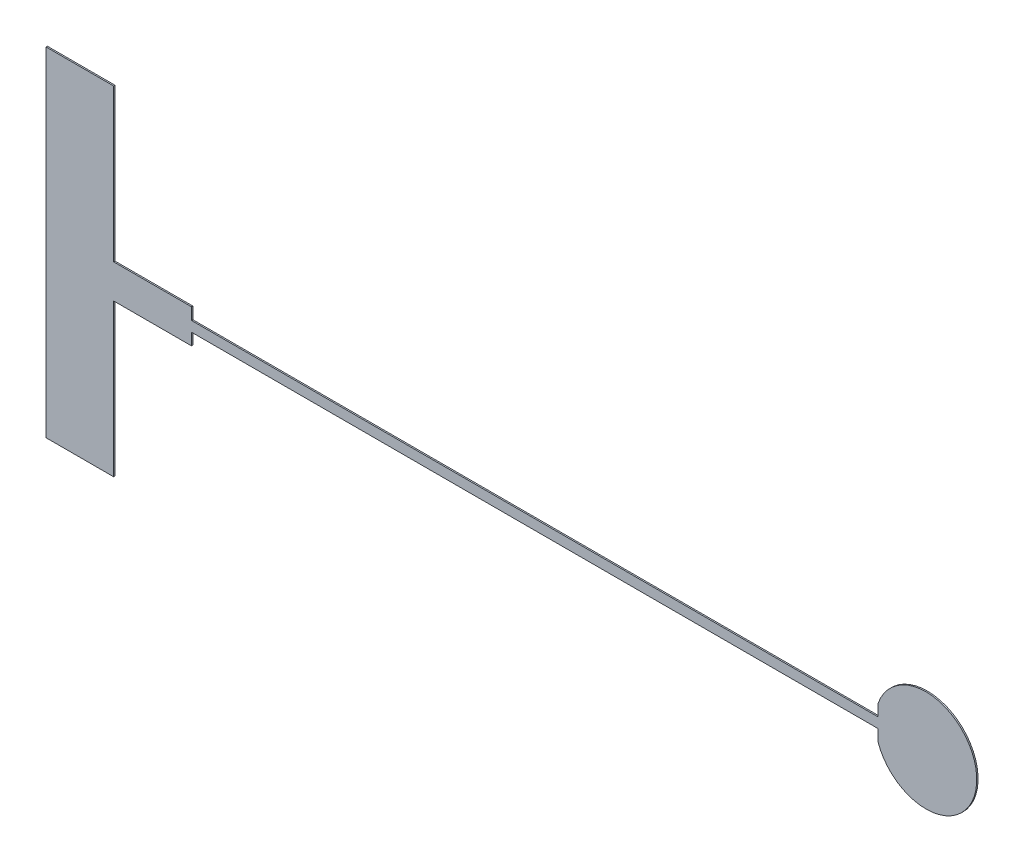
ISO-10303-21;
HEADER;
FILE_DESCRIPTION(('STEP AP214'),'2;1');
FILE_NAME('part.step','',(''),(''),'','','');
FILE_SCHEMA(('AUTOMOTIVE_DESIGN { 1 0 10303 214 1 1 1 1 }'));
ENDSEC;
DATA;
#1=APPLICATION_CONTEXT('core data for automotive mechanical design processes');
#2=APPLICATION_PROTOCOL_DEFINITION('international standard','automotive_design',2000,#1);
#3=PRODUCT_CONTEXT('',#1,'mechanical');
#4=PRODUCT('Part','Part','',(#3));
#5=PRODUCT_RELATED_PRODUCT_CATEGORY('part','',(#4));
#6=PRODUCT_DEFINITION_FORMATION('','',#4);
#7=PRODUCT_DEFINITION_CONTEXT('part definition',#1,'design');
#8=PRODUCT_DEFINITION('design','',#6,#7);
#9=PRODUCT_DEFINITION_SHAPE('','',#8);
#10=(LENGTH_UNIT() NAMED_UNIT(*) SI_UNIT(.MILLI.,.METRE.));
#11=(NAMED_UNIT(*) PLANE_ANGLE_UNIT() SI_UNIT($,.RADIAN.));
#12=(NAMED_UNIT(*) SI_UNIT($,.STERADIAN.) SOLID_ANGLE_UNIT());
#13=UNCERTAINTY_MEASURE_WITH_UNIT(LENGTH_MEASURE(1.E-05),#10,'distance_accuracy_value','');
#14=(GEOMETRIC_REPRESENTATION_CONTEXT(3) GLOBAL_UNCERTAINTY_ASSIGNED_CONTEXT((#13)) GLOBAL_UNIT_ASSIGNED_CONTEXT((#10,
#11,#12)) REPRESENTATION_CONTEXT('',''));
#15=CARTESIAN_POINT('',(0.,0.,0.));
#16=DIRECTION('',(0.,0.,1.));
#17=DIRECTION('',(1.,0.,0.));
#18=AXIS2_PLACEMENT_3D('',#15,#16,#17);
#19=CARTESIAN_POINT('',(12000.,2.44249065417534E-12,-20.));
#20=DIRECTION('',(0.,0.,1.));
#21=DIRECTION('',(1.,0.,0.));
#22=AXIS2_PLACEMENT_3D('',#19,#20,#21);
#23=PLANE('',#22);
#24=DIRECTION('',(1.,0.,0.));
#25=VECTOR('',#24,1.);
#26=CARTESIAN_POINT('',(1150.,-75.0000000000006,-20.));
#27=LINE('',#26,#25);
#28=CARTESIAN_POINT('',(1150.,-75.0000000000006,-20.));
#29=VERTEX_POINT('',#28);
#30=CARTESIAN_POINT('',(11292.8932188135,-75.0000000000006,-20.));
#31=VERTEX_POINT('',#30);
#32=EDGE_CURVE('E147',#29,#31,#27,.T.);
#33=ORIENTED_EDGE('',*,*,#32,.F.);
#34=DIRECTION('',(0.,1.,0.));
#35=VECTOR('',#34,1.);
#36=CARTESIAN_POINT('',(1150.,-250.000000000001,-20.));
#37=LINE('',#36,#35);
#38=CARTESIAN_POINT('',(1150.,-250.000000000001,-20.));
#39=VERTEX_POINT('',#38);
#40=EDGE_CURVE('E156',#39,#29,#37,.T.);
#41=ORIENTED_EDGE('',*,*,#40,.F.);
#42=DIRECTION('',(1.,0.,0.));
#43=VECTOR('',#42,1.);
#44=CARTESIAN_POINT('',(1000.,-250.,-20.));
#45=LINE('',#44,#43);
#46=CARTESIAN_POINT('',(0.,-250.,-20.));
#47=VERTEX_POINT('',#46);
#48=EDGE_CURVE('E253',#47,#39,#45,.T.);
#49=ORIENTED_EDGE('',*,*,#48,.F.);
#50=DIRECTION('',(0.,-1.,0.));
#51=VECTOR('',#50,1.);
#52=CARTESIAN_POINT('',(0.,-2500.,-20.));
#53=LINE('',#52,#51);
#54=CARTESIAN_POINT('',(0.,-2500.,-20.));
#55=VERTEX_POINT('',#54);
#56=EDGE_CURVE('E244',#47,#55,#53,.T.);
#57=ORIENTED_EDGE('',*,*,#56,.T.);
#58=DIRECTION('',(1.,0.,0.));
#59=VECTOR('',#58,1.);
#60=CARTESIAN_POINT('',(-1000.,-2500.,-20.));
#61=LINE('',#60,#59);
#62=CARTESIAN_POINT('',(-1000.,-2500.,-20.));
#63=VERTEX_POINT('',#62);
#64=EDGE_CURVE('E270',#63,#55,#61,.T.);
#65=ORIENTED_EDGE('',*,*,#64,.F.);
#66=DIRECTION('',(0.,-1.,0.));
#67=VECTOR('',#66,1.);
#68=CARTESIAN_POINT('',(-1000.,2500.,-20.));
#69=LINE('',#68,#67);
#70=CARTESIAN_POINT('',(-1000.,2500.,-20.));
#71=VERTEX_POINT('',#70);
#72=EDGE_CURVE('E266',#71,#63,#69,.T.);
#73=ORIENTED_EDGE('',*,*,#72,.F.);
#74=DIRECTION('',(-1.,0.,0.));
#75=VECTOR('',#74,1.);
#76=CARTESIAN_POINT('',(-1000.,2500.,-20.));
#77=LINE('',#76,#75);
#78=CARTESIAN_POINT('',(-4.44089209850063E-13,2500.,-20.));
#79=VERTEX_POINT('',#78);
#80=EDGE_CURVE('E263',#79,#71,#77,.T.);
#81=ORIENTED_EDGE('',*,*,#80,.F.);
#82=DIRECTION('',(0.,-1.,0.));
#83=VECTOR('',#82,1.);
#84=CARTESIAN_POINT('',(-4.44089209850063E-13,2500.,-20.));
#85=LINE('',#84,#83);
#86=CARTESIAN_POINT('',(-2.22044604925031E-13,250.,-20.));
#87=VERTEX_POINT('',#86);
#88=EDGE_CURVE('E225',#79,#87,#85,.T.);
#89=ORIENTED_EDGE('',*,*,#88,.T.);
#90=DIRECTION('',(-1.,0.,0.));
#91=VECTOR('',#90,1.);
#92=CARTESIAN_POINT('',(1000.,250.,-20.));
#93=LINE('',#92,#91);
#94=CARTESIAN_POINT('',(1150.,250.000000000001,-20.));
#95=VERTEX_POINT('',#94);
#96=EDGE_CURVE('E260',#95,#87,#93,.T.);
#97=ORIENTED_EDGE('',*,*,#96,.F.);
#98=DIRECTION('',(0.,-1.,0.));
#99=VECTOR('',#98,1.);
#100=CARTESIAN_POINT('',(1150.,250.000000000001,-20.));
#101=LINE('',#100,#99);
#102=CARTESIAN_POINT('',(1150.,75.0000000000006,-20.));
#103=VERTEX_POINT('',#102);
#104=EDGE_CURVE('E205',#95,#103,#101,.T.);
#105=ORIENTED_EDGE('',*,*,#104,.T.);
#106=DIRECTION('',(1.,0.,0.));
#107=VECTOR('',#106,1.);
#108=CARTESIAN_POINT('',(1150.,75.0000000000006,-20.));
#109=LINE('',#108,#107);
#110=CARTESIAN_POINT('',(11292.8932188135,75.0000000000006,-20.));
#111=VERTEX_POINT('',#110);
#112=EDGE_CURVE('E180',#103,#111,#109,.T.);
#113=ORIENTED_EDGE('',*,*,#112,.T.);
#114=DIRECTION('',(0.,1.,0.));
#115=VECTOR('',#114,1.);
#116=CARTESIAN_POINT('',(11292.8932188135,250.000000000001,-20.));
#117=LINE('',#116,#115);
#118=CARTESIAN_POINT('',(11292.8932188135,250.000000000001,-20.));
#119=VERTEX_POINT('',#118);
#120=EDGE_CURVE('E208',#111,#119,#117,.T.);
#121=ORIENTED_EDGE('',*,*,#120,.T.);
#122=CARTESIAN_POINT('',(12000.,2.44249065417534E-12,-20.));
#123=DIRECTION('',(0.,0.,1.));
#124=DIRECTION('',(1.,0.,0.));
#125=AXIS2_PLACEMENT_3D('',#122,#123,#124);
#126=CIRCLE('',#125,749.999999999999);
#127=CARTESIAN_POINT('',(11292.8932188135,-250.,-20.));
#128=VERTEX_POINT('',#127);
#129=EDGE_CURVE('E150',#128,#119,#126,.T.);
#130=ORIENTED_EDGE('',*,*,#129,.F.);
#131=DIRECTION('',(0.,-1.,0.));
#132=VECTOR('',#131,1.);
#133=CARTESIAN_POINT('',(11292.8932188135,-250.000000000001,-20.));
#134=LINE('',#133,#132);
#135=EDGE_CURVE('E144',#31,#128,#134,.T.);
#136=ORIENTED_EDGE('',*,*,#135,.F.);
#137=EDGE_LOOP('',(#33,#41,#49,#57,#65,#73,#81,#89,#97,#105,#113,#121,#130,#136));
#138=FACE_BOUND('',#137,.T.);
#139=ADVANCED_FACE('F42',(#138),#23,.F.);
#140=CARTESIAN_POINT('',(12000.,2.44249065417534E-12,0.));
#141=DIRECTION('',(0.,0.,1.));
#142=DIRECTION('',(1.,0.,0.));
#143=AXIS2_PLACEMENT_3D('',#140,#141,#142);
#144=PLANE('',#143);
#145=DIRECTION('',(0.,1.,0.));
#146=VECTOR('',#145,1.);
#147=CARTESIAN_POINT('',(1150.,-250.000000000001,0.));
#148=LINE('',#147,#146);
#149=CARTESIAN_POINT('',(1150.,-250.000000000001,0.));
#150=VERTEX_POINT('',#149);
#151=CARTESIAN_POINT('',(1150.,-75.0000000000006,0.));
#152=VERTEX_POINT('',#151);
#153=EDGE_CURVE('E191',#150,#152,#148,.T.);
#154=ORIENTED_EDGE('',*,*,#153,.T.);
#155=DIRECTION('',(1.,0.,0.));
#156=VECTOR('',#155,1.);
#157=CARTESIAN_POINT('',(1150.,-75.0000000000006,0.));
#158=LINE('',#157,#156);
#159=CARTESIAN_POINT('',(11292.8932188135,-75.0000000000006,0.));
#160=VERTEX_POINT('',#159);
#161=EDGE_CURVE('E168',#152,#160,#158,.T.);
#162=ORIENTED_EDGE('',*,*,#161,.T.);
#163=DIRECTION('',(0.,-1.,0.));
#164=VECTOR('',#163,1.);
#165=CARTESIAN_POINT('',(11292.8932188135,-250.000000000001,0.));
#166=LINE('',#165,#164);
#167=CARTESIAN_POINT('',(11292.8932188135,-250.000000000001,0.));
#168=VERTEX_POINT('',#167);
#169=EDGE_CURVE('E172',#160,#168,#166,.T.);
#170=ORIENTED_EDGE('',*,*,#169,.T.);
#171=CARTESIAN_POINT('',(12000.,2.44249065417534E-12,0.));
#172=DIRECTION('',(0.,0.,1.));
#173=DIRECTION('',(1.,0.,0.));
#174=AXIS2_PLACEMENT_3D('',#171,#172,#173);
#175=CIRCLE('',#174,749.999999999999);
#176=CARTESIAN_POINT('',(11292.8932188135,250.000000000001,0.));
#177=VERTEX_POINT('',#176);
#178=EDGE_CURVE('E277',#168,#177,#175,.T.);
#179=ORIENTED_EDGE('',*,*,#178,.T.);
#180=DIRECTION('',(0.,1.,0.));
#181=VECTOR('',#180,1.);
#182=CARTESIAN_POINT('',(11292.8932188135,250.000000000001,0.));
#183=LINE('',#182,#181);
#184=CARTESIAN_POINT('',(11292.8932188135,75.0000000000006,0.));
#185=VERTEX_POINT('',#184);
#186=EDGE_CURVE('E58',#185,#177,#183,.T.);
#187=ORIENTED_EDGE('',*,*,#186,.F.);
#188=DIRECTION('',(1.,0.,0.));
#189=VECTOR('',#188,1.);
#190=CARTESIAN_POINT('',(1150.,75.0000000000006,0.));
#191=LINE('',#190,#189);
#192=CARTESIAN_POINT('',(1150.,75.0000000000006,0.));
#193=VERTEX_POINT('',#192);
#194=EDGE_CURVE('E176',#193,#185,#191,.T.);
#195=ORIENTED_EDGE('',*,*,#194,.F.);
#196=DIRECTION('',(0.,-1.,0.));
#197=VECTOR('',#196,1.);
#198=CARTESIAN_POINT('',(1150.,250.000000000001,0.));
#199=LINE('',#198,#197);
#200=CARTESIAN_POINT('',(1150.,250.000000000001,0.));
#201=VERTEX_POINT('',#200);
#202=EDGE_CURVE('E204',#201,#193,#199,.T.);
#203=ORIENTED_EDGE('',*,*,#202,.F.);
#204=DIRECTION('',(-1.,0.,0.));
#205=VECTOR('',#204,1.);
#206=CARTESIAN_POINT('',(1000.,250.,0.));
#207=LINE('',#206,#205);
#208=CARTESIAN_POINT('',(-2.22044604925031E-13,250.,0.));
#209=VERTEX_POINT('',#208);
#210=EDGE_CURVE('E281',#201,#209,#207,.T.);
#211=ORIENTED_EDGE('',*,*,#210,.T.);
#212=DIRECTION('',(0.,-1.,0.));
#213=VECTOR('',#212,1.);
#214=CARTESIAN_POINT('',(-4.44089209850063E-13,2500.,0.));
#215=LINE('',#214,#213);
#216=CARTESIAN_POINT('',(0.,2500.,0.));
#217=VERTEX_POINT('',#216);
#218=EDGE_CURVE('E229',#217,#209,#215,.T.);
#219=ORIENTED_EDGE('',*,*,#218,.F.);
#220=DIRECTION('',(-1.,0.,0.));
#221=VECTOR('',#220,1.);
#222=CARTESIAN_POINT('',(-1000.,2500.,0.));
#223=LINE('',#222,#221);
#224=CARTESIAN_POINT('',(-1000.,2500.,0.));
#225=VERTEX_POINT('',#224);
#226=EDGE_CURVE('E284',#217,#225,#223,.T.);
#227=ORIENTED_EDGE('',*,*,#226,.T.);
#228=DIRECTION('',(0.,-1.,0.));
#229=VECTOR('',#228,1.);
#230=CARTESIAN_POINT('',(-1000.,2500.,0.));
#231=LINE('',#230,#229);
#232=CARTESIAN_POINT('',(-1000.,-2500.,0.));
#233=VERTEX_POINT('',#232);
#234=EDGE_CURVE('E287',#225,#233,#231,.T.);
#235=ORIENTED_EDGE('',*,*,#234,.T.);
#236=DIRECTION('',(1.,0.,0.));
#237=VECTOR('',#236,1.);
#238=CARTESIAN_POINT('',(-1000.,-2500.,0.));
#239=LINE('',#238,#237);
#240=CARTESIAN_POINT('',(0.,-2500.,0.));
#241=VERTEX_POINT('',#240);
#242=EDGE_CURVE('E257',#233,#241,#239,.T.);
#243=ORIENTED_EDGE('',*,*,#242,.T.);
#244=DIRECTION('',(0.,-1.,0.));
#245=VECTOR('',#244,1.);
#246=CARTESIAN_POINT('',(0.,-2500.,0.));
#247=LINE('',#246,#245);
#248=CARTESIAN_POINT('',(0.,-250.,0.));
#249=VERTEX_POINT('',#248);
#250=EDGE_CURVE('E232',#249,#241,#247,.T.);
#251=ORIENTED_EDGE('',*,*,#250,.F.);
#252=DIRECTION('',(1.,0.,0.));
#253=VECTOR('',#252,1.);
#254=CARTESIAN_POINT('',(1000.,-250.,0.));
#255=LINE('',#254,#253);
#256=EDGE_CURVE('E237',#249,#150,#255,.T.);
#257=ORIENTED_EDGE('',*,*,#256,.T.);
#258=EDGE_LOOP('',(#154,#162,#170,#179,#187,#195,#203,#211,#219,#227,#235,#243,#251,#257));
#259=FACE_BOUND('',#258,.T.);
#260=ADVANCED_FACE('F296',(#259),#144,.T.);
#261=CARTESIAN_POINT('',(1000.,-250.,-20.));
#262=DIRECTION('',(0.,-1.,0.));
#263=DIRECTION('',(1.,0.,0.));
#264=AXIS2_PLACEMENT_3D('',#261,#262,#263);
#265=PLANE('',#264);
#266=ORIENTED_EDGE('',*,*,#48,.T.);
#267=DIRECTION('',(0.,0.,1.));
#268=VECTOR('',#267,1.);
#269=CARTESIAN_POINT('',(1150.,-250.000000000001,-20.));
#270=LINE('',#269,#268);
#271=EDGE_CURVE('E155',#39,#150,#270,.T.);
#272=ORIENTED_EDGE('',*,*,#271,.T.);
#273=ORIENTED_EDGE('',*,*,#256,.F.);
#274=DIRECTION('',(0.,0.,1.));
#275=VECTOR('',#274,1.);
#276=CARTESIAN_POINT('',(0.,-250.,-20.));
#277=LINE('',#276,#275);
#278=EDGE_CURVE('E240',#47,#249,#277,.T.);
#279=ORIENTED_EDGE('',*,*,#278,.F.);
#280=EDGE_LOOP('',(#266,#272,#273,#279));
#281=FACE_BOUND('',#280,.T.);
#282=ADVANCED_FACE('F44',(#281),#265,.T.);
#283=CARTESIAN_POINT('',(-1000.,-2500.,-20.));
#284=DIRECTION('',(0.,-1.,0.));
#285=DIRECTION('',(0.,0.,-1.));
#286=AXIS2_PLACEMENT_3D('',#283,#284,#285);
#287=PLANE('',#286);
#288=DIRECTION('',(0.,0.,1.));
#289=VECTOR('',#288,1.);
#290=CARTESIAN_POINT('',(0.,-2500.,-20.));
#291=LINE('',#290,#289);
#292=EDGE_CURVE('E224',#55,#241,#291,.T.);
#293=ORIENTED_EDGE('',*,*,#292,.T.);
#294=ORIENTED_EDGE('',*,*,#242,.F.);
#295=DIRECTION('',(0.,0.,1.));
#296=VECTOR('',#295,1.);
#297=CARTESIAN_POINT('',(-1000.,-2500.,-20.));
#298=LINE('',#297,#296);
#299=EDGE_CURVE('E11',#63,#233,#298,.T.);
#300=ORIENTED_EDGE('',*,*,#299,.F.);
#301=ORIENTED_EDGE('',*,*,#64,.T.);
#302=EDGE_LOOP('',(#293,#294,#300,#301));
#303=FACE_BOUND('',#302,.T.);
#304=ADVANCED_FACE('F299',(#303),#287,.T.);
#305=CARTESIAN_POINT('',(-1000.,2500.,-20.));
#306=DIRECTION('',(-1.,0.,0.));
#307=DIRECTION('',(0.,-1.,0.));
#308=AXIS2_PLACEMENT_3D('',#305,#306,#307);
#309=PLANE('',#308);
#310=ORIENTED_EDGE('',*,*,#234,.F.);
#311=DIRECTION('',(0.,0.,1.));
#312=VECTOR('',#311,1.);
#313=CARTESIAN_POINT('',(-1000.,2500.,-20.));
#314=LINE('',#313,#312);
#315=EDGE_CURVE('E46',#71,#225,#314,.T.);
#316=ORIENTED_EDGE('',*,*,#315,.F.);
#317=ORIENTED_EDGE('',*,*,#72,.T.);
#318=ORIENTED_EDGE('',*,*,#299,.T.);
#319=EDGE_LOOP('',(#310,#316,#317,#318));
#320=FACE_BOUND('',#319,.T.);
#321=ADVANCED_FACE('F332',(#320),#309,.T.);
#322=CARTESIAN_POINT('',(-1000.,2500.,-20.));
#323=DIRECTION('',(0.,1.,0.));
#324=DIRECTION('',(0.,0.,1.));
#325=AXIS2_PLACEMENT_3D('',#322,#323,#324);
#326=PLANE('',#325);
#327=DIRECTION('',(0.,0.,1.));
#328=VECTOR('',#327,1.);
#329=CARTESIAN_POINT('',(-4.44089209850063E-13,2500.,-20.));
#330=LINE('',#329,#328);
#331=EDGE_CURVE('E66',#79,#217,#330,.T.);
#332=ORIENTED_EDGE('',*,*,#331,.F.);
#333=ORIENTED_EDGE('',*,*,#80,.T.);
#334=ORIENTED_EDGE('',*,*,#315,.T.);
#335=ORIENTED_EDGE('',*,*,#226,.F.);
#336=EDGE_LOOP('',(#332,#333,#334,#335));
#337=FACE_BOUND('',#336,.T.);
#338=ADVANCED_FACE('F335',(#337),#326,.T.);
#339=CARTESIAN_POINT('',(1000.,250.,-20.));
#340=DIRECTION('',(0.,1.,0.));
#341=DIRECTION('',(0.,0.,1.));
#342=AXIS2_PLACEMENT_3D('',#339,#340,#341);
#343=PLANE('',#342);
#344=DIRECTION('',(0.,0.,1.));
#345=VECTOR('',#344,1.);
#346=CARTESIAN_POINT('',(1150.,250.000000000001,-20.));
#347=LINE('',#346,#345);
#348=EDGE_CURVE('E211',#95,#201,#347,.T.);
#349=ORIENTED_EDGE('',*,*,#348,.F.);
#350=ORIENTED_EDGE('',*,*,#96,.T.);
#351=DIRECTION('',(0.,0.,1.));
#352=VECTOR('',#351,1.);
#353=CARTESIAN_POINT('',(-2.22044604925031E-13,250.,-20.));
#354=LINE('',#353,#352);
#355=EDGE_CURVE('E233',#87,#209,#354,.T.);
#356=ORIENTED_EDGE('',*,*,#355,.T.);
#357=ORIENTED_EDGE('',*,*,#210,.F.);
#358=EDGE_LOOP('',(#349,#350,#356,#357));
#359=FACE_BOUND('',#358,.T.);
#360=ADVANCED_FACE('F339',(#359),#343,.T.);
#361=CARTESIAN_POINT('',(12000.,2.44249065417534E-12,-20.));
#362=DIRECTION('',(0.,0.,1.));
#363=DIRECTION('',(1.,0.,0.));
#364=AXIS2_PLACEMENT_3D('',#361,#362,#363);
#365=CYLINDRICAL_SURFACE('',#364,749.999999999999);
#366=DIRECTION('',(0.,0.,1.));
#367=VECTOR('',#366,1.);
#368=CARTESIAN_POINT('',(11292.8932188135,250.,-20.));
#369=LINE('',#368,#367);
#370=EDGE_CURVE('E218',#177,#119,#369,.F.);
#371=ORIENTED_EDGE('',*,*,#370,.F.);
#372=ORIENTED_EDGE('',*,*,#178,.F.);
#373=DIRECTION('',(0.,0.,1.));
#374=VECTOR('',#373,1.);
#375=CARTESIAN_POINT('',(11292.8932188135,-250.,-20.));
#376=LINE('',#375,#374);
#377=EDGE_CURVE('E221',#128,#168,#376,.T.);
#378=ORIENTED_EDGE('',*,*,#377,.F.);
#379=ORIENTED_EDGE('',*,*,#129,.T.);
#380=EDGE_LOOP('',(#371,#372,#378,#379));
#381=FACE_BOUND('',#380,.T.);
#382=ADVANCED_FACE('F342',(#381),#365,.T.);
#383=CARTESIAN_POINT('',(0.,-2500.,-20.));
#384=DIRECTION('',(-1.,0.,0.));
#385=DIRECTION('',(0.,0.,1.));
#386=AXIS2_PLACEMENT_3D('',#383,#384,#385);
#387=PLANE('',#386);
#388=ORIENTED_EDGE('',*,*,#250,.T.);
#389=ORIENTED_EDGE('',*,*,#292,.F.);
#390=ORIENTED_EDGE('',*,*,#56,.F.);
#391=ORIENTED_EDGE('',*,*,#278,.T.);
#392=EDGE_LOOP('',(#388,#389,#390,#391));
#393=FACE_BOUND('',#392,.T.);
#394=ADVANCED_FACE('F303',(#393),#387,.F.);
#395=CARTESIAN_POINT('',(-4.44089209850063E-13,2500.,-20.));
#396=DIRECTION('',(-1.,0.,0.));
#397=DIRECTION('',(0.,-1.,0.));
#398=AXIS2_PLACEMENT_3D('',#395,#396,#397);
#399=PLANE('',#398);
#400=ORIENTED_EDGE('',*,*,#218,.T.);
#401=ORIENTED_EDGE('',*,*,#355,.F.);
#402=ORIENTED_EDGE('',*,*,#88,.F.);
#403=ORIENTED_EDGE('',*,*,#331,.T.);
#404=EDGE_LOOP('',(#400,#401,#402,#403));
#405=FACE_BOUND('',#404,.T.);
#406=ADVANCED_FACE('F349',(#405),#399,.F.);
#407=CARTESIAN_POINT('',(1150.,250.000000000001,-20.));
#408=DIRECTION('',(-1.,0.,0.));
#409=DIRECTION('',(0.,-1.,0.));
#410=AXIS2_PLACEMENT_3D('',#407,#408,#409);
#411=PLANE('',#410);
#412=ORIENTED_EDGE('',*,*,#202,.T.);
#413=DIRECTION('',(0.,0.,1.));
#414=VECTOR('',#413,1.);
#415=CARTESIAN_POINT('',(1150.,75.0000000000006,-20.));
#416=LINE('',#415,#414);
#417=EDGE_CURVE('E184',#103,#193,#416,.T.);
#418=ORIENTED_EDGE('',*,*,#417,.F.);
#419=ORIENTED_EDGE('',*,*,#104,.F.);
#420=ORIENTED_EDGE('',*,*,#348,.T.);
#421=EDGE_LOOP('',(#412,#418,#419,#420));
#422=FACE_BOUND('',#421,.T.);
#423=ADVANCED_FACE('F319',(#422),#411,.F.);
#424=CARTESIAN_POINT('',(11292.8932188135,250.000000000001,-20.));
#425=DIRECTION('',(1.,0.,0.));
#426=DIRECTION('',(0.,0.,-1.));
#427=AXIS2_PLACEMENT_3D('',#424,#425,#426);
#428=PLANE('',#427);
#429=ORIENTED_EDGE('',*,*,#186,.T.);
#430=ORIENTED_EDGE('',*,*,#370,.T.);
#431=ORIENTED_EDGE('',*,*,#120,.F.);
#432=DIRECTION('',(0.,0.,1.));
#433=VECTOR('',#432,1.);
#434=CARTESIAN_POINT('',(11292.8932188135,75.0000000000006,-20.));
#435=LINE('',#434,#433);
#436=EDGE_CURVE('E188',#111,#185,#435,.T.);
#437=ORIENTED_EDGE('',*,*,#436,.T.);
#438=EDGE_LOOP('',(#429,#430,#431,#437));
#439=FACE_BOUND('',#438,.T.);
#440=ADVANCED_FACE('F311',(#439),#428,.F.);
#441=CARTESIAN_POINT('',(1150.,-250.000000000001,-20.));
#442=DIRECTION('',(1.,0.,0.));
#443=DIRECTION('',(0.,1.,0.));
#444=AXIS2_PLACEMENT_3D('',#441,#442,#443);
#445=PLANE('',#444);
#446=ORIENTED_EDGE('',*,*,#153,.F.);
#447=ORIENTED_EDGE('',*,*,#271,.F.);
#448=ORIENTED_EDGE('',*,*,#40,.T.);
#449=DIRECTION('',(0.,0.,1.));
#450=VECTOR('',#449,1.);
#451=CARTESIAN_POINT('',(1150.,-75.0000000000006,-20.));
#452=LINE('',#451,#450);
#453=EDGE_CURVE('E166',#29,#152,#452,.T.);
#454=ORIENTED_EDGE('',*,*,#453,.T.);
#455=EDGE_LOOP('',(#446,#447,#448,#454));
#456=FACE_BOUND('',#455,.T.);
#457=ADVANCED_FACE('F309',(#456),#445,.T.);
#458=CARTESIAN_POINT('',(11292.8932188135,-250.000000000001,-20.));
#459=DIRECTION('',(-1.,0.,0.));
#460=DIRECTION('',(0.,0.,1.));
#461=AXIS2_PLACEMENT_3D('',#458,#459,#460);
#462=PLANE('',#461);
#463=ORIENTED_EDGE('',*,*,#169,.F.);
#464=DIRECTION('',(0.,0.,1.));
#465=VECTOR('',#464,1.);
#466=CARTESIAN_POINT('',(11292.8932188135,-75.0000000000006,-20.));
#467=LINE('',#466,#465);
#468=EDGE_CURVE('E163',#31,#160,#467,.T.);
#469=ORIENTED_EDGE('',*,*,#468,.F.);
#470=ORIENTED_EDGE('',*,*,#135,.T.);
#471=ORIENTED_EDGE('',*,*,#377,.T.);
#472=EDGE_LOOP('',(#463,#469,#470,#471));
#473=FACE_BOUND('',#472,.T.);
#474=ADVANCED_FACE('F170',(#473),#462,.T.);
#475=CARTESIAN_POINT('',(1150.,75.0000000000006,-20.));
#476=DIRECTION('',(0.,-1.,0.));
#477=DIRECTION('',(0.,0.,-1.));
#478=AXIS2_PLACEMENT_3D('',#475,#476,#477);
#479=PLANE('',#478);
#480=ORIENTED_EDGE('',*,*,#194,.T.);
#481=ORIENTED_EDGE('',*,*,#436,.F.);
#482=ORIENTED_EDGE('',*,*,#112,.F.);
#483=ORIENTED_EDGE('',*,*,#417,.T.);
#484=EDGE_LOOP('',(#480,#481,#482,#483));
#485=FACE_BOUND('',#484,.T.);
#486=ADVANCED_FACE('F317',(#485),#479,.F.);
#487=CARTESIAN_POINT('',(1150.,-75.0000000000006,-20.));
#488=DIRECTION('',(0.,-1.,0.));
#489=DIRECTION('',(0.,0.,-1.));
#490=AXIS2_PLACEMENT_3D('',#487,#488,#489);
#491=PLANE('',#490);
#492=ORIENTED_EDGE('',*,*,#161,.F.);
#493=ORIENTED_EDGE('',*,*,#453,.F.);
#494=ORIENTED_EDGE('',*,*,#32,.T.);
#495=ORIENTED_EDGE('',*,*,#468,.T.);
#496=EDGE_LOOP('',(#492,#493,#494,#495));
#497=FACE_BOUND('',#496,.T.);
#498=ADVANCED_FACE('F162',(#497),#491,.T.);
#499=CLOSED_SHELL('',(#139,#260,#282,#304,#321,#338,#360,#382,#394,#406,#423,#440,#457,#474,
#486,#498));
#500=MANIFOLD_SOLID_BREP('B2',#499);
#501=ADVANCED_BREP_SHAPE_REPRESENTATION('',(#18,#500),#14);
#502=SHAPE_DEFINITION_REPRESENTATION(#9,#501);
ENDSEC;
END-ISO-10303-21;
